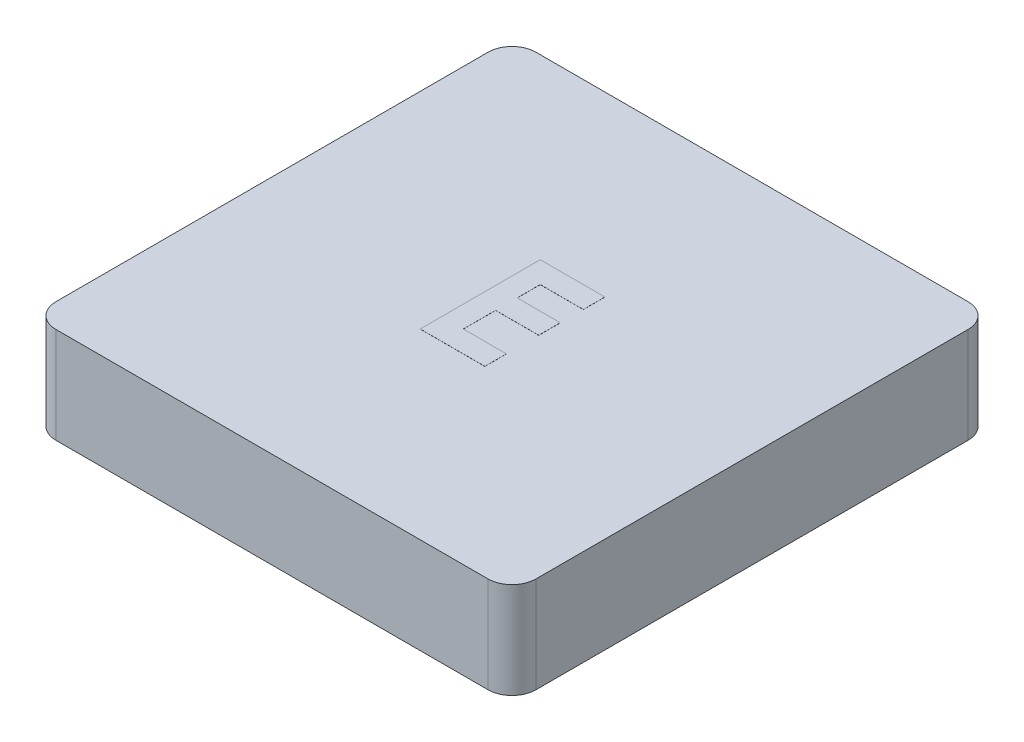
ISO-10303-21;
HEADER;
FILE_DESCRIPTION(('STEP AP214'),'2;1');
FILE_NAME('part.step','',(''),(''),'','','');
FILE_SCHEMA(('AUTOMOTIVE_DESIGN { 1 0 10303 214 1 1 1 1 }'));
ENDSEC;
DATA;
#1=APPLICATION_CONTEXT('core data for automotive mechanical design processes');
#2=APPLICATION_PROTOCOL_DEFINITION('international standard','automotive_design',2000,#1);
#3=PRODUCT_CONTEXT('',#1,'mechanical');
#4=PRODUCT('Part','Part','',(#3));
#5=PRODUCT_RELATED_PRODUCT_CATEGORY('part','',(#4));
#6=PRODUCT_DEFINITION_FORMATION('','',#4);
#7=PRODUCT_DEFINITION_CONTEXT('part definition',#1,'design');
#8=PRODUCT_DEFINITION('design','',#6,#7);
#9=PRODUCT_DEFINITION_SHAPE('','',#8);
#10=(LENGTH_UNIT() NAMED_UNIT(*) SI_UNIT(.MILLI.,.METRE.));
#11=(NAMED_UNIT(*) PLANE_ANGLE_UNIT() SI_UNIT($,.RADIAN.));
#12=(NAMED_UNIT(*) SI_UNIT($,.STERADIAN.) SOLID_ANGLE_UNIT());
#13=UNCERTAINTY_MEASURE_WITH_UNIT(LENGTH_MEASURE(1.E-05),#10,'distance_accuracy_value','');
#14=(GEOMETRIC_REPRESENTATION_CONTEXT(3) GLOBAL_UNCERTAINTY_ASSIGNED_CONTEXT((#13)) GLOBAL_UNIT_ASSIGNED_CONTEXT((#10,
#11,#12)) REPRESENTATION_CONTEXT('',''));
#15=CARTESIAN_POINT('',(0.,0.,0.));
#16=DIRECTION('',(0.,0.,1.));
#17=DIRECTION('',(1.,0.,0.));
#18=AXIS2_PLACEMENT_3D('',#15,#16,#17);
#19=CARTESIAN_POINT('',(0.,2.54,-12.7));
#20=DIRECTION('',(1.,0.,0.));
#21=DIRECTION('',(0.,0.,-1.));
#22=AXIS2_PLACEMENT_3D('',#19,#20,#21);
#23=PLANE('',#22);
#24=DIRECTION('',(0.,0.,1.));
#25=VECTOR('',#24,1.);
#26=CARTESIAN_POINT('',(0.,2.54,-12.7));
#27=LINE('',#26,#25);
#28=CARTESIAN_POINT('',(0.,2.54,-12.065));
#29=VERTEX_POINT('',#28);
#30=CARTESIAN_POINT('',(0.,2.54,-0.635));
#31=VERTEX_POINT('',#30);
#32=EDGE_CURVE('E336',#29,#31,#27,.T.);
#33=ORIENTED_EDGE('',*,*,#32,.F.);
#34=DIRECTION('',(0.,-1.,0.));
#35=VECTOR('',#34,1.);
#36=CARTESIAN_POINT('',(0.,2.54,-12.065));
#37=LINE('',#36,#35);
#38=CARTESIAN_POINT('',(0.,0.,-12.065));
#39=VERTEX_POINT('',#38);
#40=EDGE_CURVE('E361',#29,#39,#37,.T.);
#41=ORIENTED_EDGE('',*,*,#40,.T.);
#42=DIRECTION('',(0.,0.,1.));
#43=VECTOR('',#42,1.);
#44=CARTESIAN_POINT('',(0.,0.,-12.7));
#45=LINE('',#44,#43);
#46=CARTESIAN_POINT('',(0.,0.,-0.635));
#47=VERTEX_POINT('',#46);
#48=EDGE_CURVE('E316',#39,#47,#45,.T.);
#49=ORIENTED_EDGE('',*,*,#48,.T.);
#50=DIRECTION('',(0.,-1.,0.));
#51=VECTOR('',#50,1.);
#52=CARTESIAN_POINT('',(0.,2.54,-0.635));
#53=LINE('',#52,#51);
#54=EDGE_CURVE('E349',#47,#31,#53,.F.);
#55=ORIENTED_EDGE('',*,*,#54,.T.);
#56=EDGE_LOOP('',(#33,#41,#49,#55));
#57=FACE_BOUND('',#56,.T.);
#58=ADVANCED_FACE('F33',(#57),#23,.F.);
#59=CARTESIAN_POINT('',(0.,2.54,0.));
#60=DIRECTION('',(0.,0.,-1.));
#61=DIRECTION('',(-1.,0.,0.));
#62=AXIS2_PLACEMENT_3D('',#59,#60,#61);
#63=PLANE('',#62);
#64=DIRECTION('',(1.,0.,0.));
#65=VECTOR('',#64,1.);
#66=CARTESIAN_POINT('',(0.,0.,0.));
#67=LINE('',#66,#65);
#68=CARTESIAN_POINT('',(0.635,0.,0.));
#69=VERTEX_POINT('',#68);
#70=CARTESIAN_POINT('',(12.065,0.,0.));
#71=VERTEX_POINT('',#70);
#72=EDGE_CURVE('E352',#69,#71,#67,.T.);
#73=ORIENTED_EDGE('',*,*,#72,.T.);
#74=DIRECTION('',(0.,-1.,0.));
#75=VECTOR('',#74,1.);
#76=CARTESIAN_POINT('',(12.065,2.54,0.));
#77=LINE('',#76,#75);
#78=CARTESIAN_POINT('',(12.065,2.54,0.));
#79=VERTEX_POINT('',#78);
#80=EDGE_CURVE('E41',#71,#79,#77,.F.);
#81=ORIENTED_EDGE('',*,*,#80,.T.);
#82=DIRECTION('',(1.,0.,0.));
#83=VECTOR('',#82,1.);
#84=CARTESIAN_POINT('',(0.,2.54,0.));
#85=LINE('',#84,#83);
#86=CARTESIAN_POINT('',(0.635,2.54,0.));
#87=VERTEX_POINT('',#86);
#88=EDGE_CURVE('E339',#87,#79,#85,.T.);
#89=ORIENTED_EDGE('',*,*,#88,.F.);
#90=DIRECTION('',(0.,-1.,0.));
#91=VECTOR('',#90,1.);
#92=CARTESIAN_POINT('',(0.635,2.54,0.));
#93=LINE('',#92,#91);
#94=EDGE_CURVE('E390',#87,#69,#93,.T.);
#95=ORIENTED_EDGE('',*,*,#94,.T.);
#96=EDGE_LOOP('',(#73,#81,#89,#95));
#97=FACE_BOUND('',#96,.T.);
#98=ADVANCED_FACE('F395',(#97),#63,.F.);
#99=CARTESIAN_POINT('',(12.7,2.54,0.));
#100=DIRECTION('',(-1.,0.,0.));
#101=DIRECTION('',(0.,0.,1.));
#102=AXIS2_PLACEMENT_3D('',#99,#100,#101);
#103=PLANE('',#102);
#104=DIRECTION('',(0.,0.,-1.));
#105=VECTOR('',#104,1.);
#106=CARTESIAN_POINT('',(12.7,0.,0.));
#107=LINE('',#106,#105);
#108=CARTESIAN_POINT('',(12.7,0.,-0.635));
#109=VERTEX_POINT('',#108);
#110=CARTESIAN_POINT('',(12.7,0.,-12.065));
#111=VERTEX_POINT('',#110);
#112=EDGE_CURVE('E355',#109,#111,#107,.T.);
#113=ORIENTED_EDGE('',*,*,#112,.T.);
#114=DIRECTION('',(0.,-1.,0.));
#115=VECTOR('',#114,1.);
#116=CARTESIAN_POINT('',(12.7,2.54,-12.065));
#117=LINE('',#116,#115);
#118=CARTESIAN_POINT('',(12.7,2.54,-12.065));
#119=VERTEX_POINT('',#118);
#120=EDGE_CURVE('E388',#111,#119,#117,.F.);
#121=ORIENTED_EDGE('',*,*,#120,.T.);
#122=DIRECTION('',(0.,0.,-1.));
#123=VECTOR('',#122,1.);
#124=CARTESIAN_POINT('',(12.7,2.54,0.));
#125=LINE('',#124,#123);
#126=CARTESIAN_POINT('',(12.7,2.54,-0.635));
#127=VERTEX_POINT('',#126);
#128=EDGE_CURVE('E343',#127,#119,#125,.T.);
#129=ORIENTED_EDGE('',*,*,#128,.F.);
#130=DIRECTION('',(0.,-1.,0.));
#131=VECTOR('',#130,1.);
#132=CARTESIAN_POINT('',(12.7,2.54,-0.635));
#133=LINE('',#132,#131);
#134=EDGE_CURVE('E385',#127,#109,#133,.T.);
#135=ORIENTED_EDGE('',*,*,#134,.T.);
#136=EDGE_LOOP('',(#113,#121,#129,#135));
#137=FACE_BOUND('',#136,.T.);
#138=ADVANCED_FACE('F408',(#137),#103,.F.);
#139=CARTESIAN_POINT('',(12.7,2.54,-12.7));
#140=DIRECTION('',(0.,0.,1.));
#141=DIRECTION('',(1.,0.,0.));
#142=AXIS2_PLACEMENT_3D('',#139,#140,#141);
#143=PLANE('',#142);
#144=DIRECTION('',(-1.,0.,0.));
#145=VECTOR('',#144,1.);
#146=CARTESIAN_POINT('',(12.7,0.,-12.7));
#147=LINE('',#146,#145);
#148=CARTESIAN_POINT('',(12.065,0.,-12.7));
#149=VERTEX_POINT('',#148);
#150=CARTESIAN_POINT('',(0.634999999999995,0.,-12.7));
#151=VERTEX_POINT('',#150);
#152=EDGE_CURVE('E340',#149,#151,#147,.T.);
#153=ORIENTED_EDGE('',*,*,#152,.T.);
#154=DIRECTION('',(0.,-1.,0.));
#155=VECTOR('',#154,1.);
#156=CARTESIAN_POINT('',(0.634999999999995,2.54,-12.7));
#157=LINE('',#156,#155);
#158=CARTESIAN_POINT('',(0.634999999999995,2.54,-12.7));
#159=VERTEX_POINT('',#158);
#160=EDGE_CURVE('E375',#151,#159,#157,.F.);
#161=ORIENTED_EDGE('',*,*,#160,.T.);
#162=DIRECTION('',(-1.,0.,0.));
#163=VECTOR('',#162,1.);
#164=CARTESIAN_POINT('',(12.7,2.54,-12.7));
#165=LINE('',#164,#163);
#166=CARTESIAN_POINT('',(12.065,2.54,-12.7));
#167=VERTEX_POINT('',#166);
#168=EDGE_CURVE('E346',#167,#159,#165,.T.);
#169=ORIENTED_EDGE('',*,*,#168,.F.);
#170=DIRECTION('',(0.,-1.,0.));
#171=VECTOR('',#170,1.);
#172=CARTESIAN_POINT('',(12.065,2.54,-12.7));
#173=LINE('',#172,#171);
#174=EDGE_CURVE('E372',#167,#149,#173,.T.);
#175=ORIENTED_EDGE('',*,*,#174,.T.);
#176=EDGE_LOOP('',(#153,#161,#169,#175));
#177=FACE_BOUND('',#176,.T.);
#178=ADVANCED_FACE('F420',(#177),#143,.F.);
#179=CARTESIAN_POINT('',(0.,2.54,0.));
#180=DIRECTION('',(0.,1.,0.));
#181=DIRECTION('',(0.,0.,1.));
#182=AXIS2_PLACEMENT_3D('',#179,#180,#181);
#183=PLANE('',#182);
#184=DIRECTION('',(0.,0.,-1.));
#185=VECTOR('',#184,1.);
#186=CARTESIAN_POINT('',(5.44634615384615,2.54,-4.826));
#187=LINE('',#186,#185);
#188=CARTESIAN_POINT('',(5.44634615384615,2.54,-4.826));
#189=VERTEX_POINT('',#188);
#190=CARTESIAN_POINT('',(5.44634615384615,2.54,-8.001));
#191=VERTEX_POINT('',#190);
#192=EDGE_CURVE('E248',#189,#191,#187,.T.);
#193=ORIENTED_EDGE('',*,*,#192,.T.);
#194=DIRECTION('',(1.,0.,0.));
#195=VECTOR('',#194,1.);
#196=CARTESIAN_POINT('',(5.44634615384615,2.54,-8.001));
#197=LINE('',#196,#195);
#198=CARTESIAN_POINT('',(7.15596153846153,2.54,-8.001));
#199=VERTEX_POINT('',#198);
#200=EDGE_CURVE('E199',#191,#199,#197,.T.);
#201=ORIENTED_EDGE('',*,*,#200,.T.);
#202=DIRECTION('',(0.,0.,1.));
#203=VECTOR('',#202,1.);
#204=CARTESIAN_POINT('',(7.15596153846153,2.54,-8.001));
#205=LINE('',#204,#203);
#206=CARTESIAN_POINT('',(7.15596153846153,2.54,-7.4311282051282));
#207=VERTEX_POINT('',#206);
#208=EDGE_CURVE('E251',#199,#207,#205,.T.);
#209=ORIENTED_EDGE('',*,*,#208,.T.);
#210=DIRECTION('',(-1.,0.,0.));
#211=VECTOR('',#210,1.);
#212=CARTESIAN_POINT('',(7.15596153846153,2.54,-7.4311282051282));
#213=LINE('',#212,#211);
#214=CARTESIAN_POINT('',(6.01621794871794,2.54,-7.4311282051282));
#215=VERTEX_POINT('',#214);
#216=EDGE_CURVE('E253',#207,#215,#213,.T.);
#217=ORIENTED_EDGE('',*,*,#216,.T.);
#218=DIRECTION('',(0.,0.,1.));
#219=VECTOR('',#218,1.);
#220=CARTESIAN_POINT('',(6.01621794871794,2.54,-7.4311282051282));
#221=LINE('',#220,#219);
#222=CARTESIAN_POINT('',(6.01621794871794,2.54,-6.82055128205128));
#223=VERTEX_POINT('',#222);
#224=EDGE_CURVE('E255',#215,#223,#221,.T.);
#225=ORIENTED_EDGE('',*,*,#224,.T.);
#226=DIRECTION('',(1.,0.,0.));
#227=VECTOR('',#226,1.);
#228=CARTESIAN_POINT('',(6.01621794871794,2.54,-6.82055128205128));
#229=LINE('',#228,#227);
#230=CARTESIAN_POINT('',(7.15596153846153,2.54,-6.82055128205128));
#231=VERTEX_POINT('',#230);
#232=EDGE_CURVE('E257',#223,#231,#229,.T.);
#233=ORIENTED_EDGE('',*,*,#232,.T.);
#234=DIRECTION('',(0.,0.,1.));
#235=VECTOR('',#234,1.);
#236=CARTESIAN_POINT('',(7.15596153846153,2.54,-6.82055128205128));
#237=LINE('',#236,#235);
#238=CARTESIAN_POINT('',(7.15596153846153,2.54,-6.25067948717949));
#239=VERTEX_POINT('',#238);
#240=EDGE_CURVE('E259',#231,#239,#237,.T.);
#241=ORIENTED_EDGE('',*,*,#240,.T.);
#242=DIRECTION('',(-1.,0.,0.));
#243=VECTOR('',#242,1.);
#244=CARTESIAN_POINT('',(7.15596153846153,2.54,-6.25067948717949));
#245=LINE('',#244,#243);
#246=CARTESIAN_POINT('',(6.01621794871794,2.54,-6.25067948717949));
#247=VERTEX_POINT('',#246);
#248=EDGE_CURVE('E261',#239,#247,#245,.T.);
#249=ORIENTED_EDGE('',*,*,#248,.T.);
#250=DIRECTION('',(0.,0.,1.));
#251=VECTOR('',#250,1.);
#252=CARTESIAN_POINT('',(6.01621794871794,2.54,-6.25067948717949));
#253=LINE('',#252,#251);
#254=CARTESIAN_POINT('',(6.01621794871794,2.54,-5.39587179487179));
#255=VERTEX_POINT('',#254);
#256=EDGE_CURVE('E263',#247,#255,#253,.T.);
#257=ORIENTED_EDGE('',*,*,#256,.T.);
#258=DIRECTION('',(1.,0.,0.));
#259=VECTOR('',#258,1.);
#260=CARTESIAN_POINT('',(6.01621794871794,2.54,-5.39587179487179));
#261=LINE('',#260,#259);
#262=CARTESIAN_POINT('',(7.15596153846153,2.54,-5.39587179487179));
#263=VERTEX_POINT('',#262);
#264=EDGE_CURVE('E265',#255,#263,#261,.T.);
#265=ORIENTED_EDGE('',*,*,#264,.T.);
#266=DIRECTION('',(0.,0.,1.));
#267=VECTOR('',#266,1.);
#268=CARTESIAN_POINT('',(7.15596153846153,2.54,-5.39587179487179));
#269=LINE('',#268,#267);
#270=CARTESIAN_POINT('',(7.15596153846153,2.54,-4.826));
#271=VERTEX_POINT('',#270);
#272=EDGE_CURVE('E53',#263,#271,#269,.T.);
#273=ORIENTED_EDGE('',*,*,#272,.T.);
#274=DIRECTION('',(-1.,0.,0.));
#275=VECTOR('',#274,1.);
#276=CARTESIAN_POINT('',(7.15596153846153,2.54,-4.826));
#277=LINE('',#276,#275);
#278=EDGE_CURVE('E48',#271,#189,#277,.T.);
#279=ORIENTED_EDGE('',*,*,#278,.T.);
#280=EDGE_LOOP('',(#193,#201,#209,#217,#225,#233,#241,#249,#257,#265,#273,#279));
#281=FACE_BOUND('',#280,.T.);
#282=ORIENTED_EDGE('',*,*,#168,.T.);
#283=CARTESIAN_POINT('',(0.634999999999995,2.54,-12.065));
#284=DIRECTION('',(0.,1.,0.));
#285=DIRECTION('',(0.,0.,1.));
#286=AXIS2_PLACEMENT_3D('',#283,#284,#285);
#287=CIRCLE('',#286,0.635);
#288=EDGE_CURVE('E383',#159,#29,#287,.T.);
#289=ORIENTED_EDGE('',*,*,#288,.T.);
#290=ORIENTED_EDGE('',*,*,#32,.T.);
#291=CARTESIAN_POINT('',(0.635,2.54,-0.635));
#292=DIRECTION('',(0.,1.,0.));
#293=DIRECTION('',(0.,0.,1.));
#294=AXIS2_PLACEMENT_3D('',#291,#292,#293);
#295=CIRCLE('',#294,0.635);
#296=EDGE_CURVE('E377',#31,#87,#295,.T.);
#297=ORIENTED_EDGE('',*,*,#296,.T.);
#298=ORIENTED_EDGE('',*,*,#88,.T.);
#299=CARTESIAN_POINT('',(12.065,2.54,-0.635));
#300=DIRECTION('',(0.,1.,0.));
#301=DIRECTION('',(0.,0.,1.));
#302=AXIS2_PLACEMENT_3D('',#299,#300,#301);
#303=CIRCLE('',#302,0.635);
#304=EDGE_CURVE('E379',#79,#127,#303,.T.);
#305=ORIENTED_EDGE('',*,*,#304,.T.);
#306=ORIENTED_EDGE('',*,*,#128,.T.);
#307=CARTESIAN_POINT('',(12.065,2.54,-12.065));
#308=DIRECTION('',(0.,1.,0.));
#309=DIRECTION('',(0.,0.,1.));
#310=AXIS2_PLACEMENT_3D('',#307,#308,#309);
#311=CIRCLE('',#310,0.635);
#312=EDGE_CURVE('E381',#119,#167,#311,.T.);
#313=ORIENTED_EDGE('',*,*,#312,.T.);
#314=EDGE_LOOP('',(#282,#289,#290,#297,#298,#305,#306,#313));
#315=FACE_BOUND('',#314,.T.);
#316=ADVANCED_FACE('F401',(#281,#315),#183,.T.);
#317=CARTESIAN_POINT('',(0.,0.,0.));
#318=DIRECTION('',(0.,1.,0.));
#319=DIRECTION('',(0.,0.,1.));
#320=AXIS2_PLACEMENT_3D('',#317,#318,#319);
#321=PLANE('',#320);
#322=DIRECTION('',(-1.,0.,0.));
#323=VECTOR('',#322,1.);
#324=CARTESIAN_POINT('',(12.7,0.,-12.065));
#325=LINE('',#324,#323);
#326=CARTESIAN_POINT('',(12.065,0.,-12.065));
#327=VERTEX_POINT('',#326);
#328=CARTESIAN_POINT('',(0.634999999999995,0.,-12.065));
#329=VERTEX_POINT('',#328);
#330=EDGE_CURVE('E304',#327,#329,#325,.T.);
#331=ORIENTED_EDGE('',*,*,#330,.T.);
#332=DIRECTION('',(0.,0.,1.));
#333=VECTOR('',#332,1.);
#334=CARTESIAN_POINT('',(0.634999999999995,0.,-12.7));
#335=LINE('',#334,#333);
#336=CARTESIAN_POINT('',(0.635,0.,-0.635));
#337=VERTEX_POINT('',#336);
#338=EDGE_CURVE('E299',#329,#337,#335,.T.);
#339=ORIENTED_EDGE('',*,*,#338,.T.);
#340=DIRECTION('',(1.,0.,0.));
#341=VECTOR('',#340,1.);
#342=CARTESIAN_POINT('',(0.,0.,-0.635));
#343=LINE('',#342,#341);
#344=CARTESIAN_POINT('',(12.065,0.,-0.635));
#345=VERTEX_POINT('',#344);
#346=EDGE_CURVE('E328',#337,#345,#343,.T.);
#347=ORIENTED_EDGE('',*,*,#346,.T.);
#348=DIRECTION('',(0.,0.,-1.));
#349=VECTOR('',#348,1.);
#350=CARTESIAN_POINT('',(12.065,0.,0.));
#351=LINE('',#350,#349);
#352=EDGE_CURVE('E331',#345,#327,#351,.T.);
#353=ORIENTED_EDGE('',*,*,#352,.T.);
#354=EDGE_LOOP('',(#331,#339,#347,#353));
#355=FACE_BOUND('',#354,.T.);
#356=ORIENTED_EDGE('',*,*,#48,.F.);
#357=CARTESIAN_POINT('',(0.634999999999995,0.,-12.065));
#358=DIRECTION('',(0.,1.,0.));
#359=DIRECTION('',(0.,0.,1.));
#360=AXIS2_PLACEMENT_3D('',#357,#358,#359);
#361=CIRCLE('',#360,0.635);
#362=EDGE_CURVE('E370',#39,#151,#361,.F.);
#363=ORIENTED_EDGE('',*,*,#362,.T.);
#364=ORIENTED_EDGE('',*,*,#152,.F.);
#365=CARTESIAN_POINT('',(12.065,0.,-12.065));
#366=DIRECTION('',(0.,1.,0.));
#367=DIRECTION('',(0.,0.,1.));
#368=AXIS2_PLACEMENT_3D('',#365,#366,#367);
#369=CIRCLE('',#368,0.635);
#370=EDGE_CURVE('E368',#149,#111,#369,.F.);
#371=ORIENTED_EDGE('',*,*,#370,.T.);
#372=ORIENTED_EDGE('',*,*,#112,.F.);
#373=CARTESIAN_POINT('',(12.065,0.,-0.635));
#374=DIRECTION('',(0.,1.,0.));
#375=DIRECTION('',(0.,0.,1.));
#376=AXIS2_PLACEMENT_3D('',#373,#374,#375);
#377=CIRCLE('',#376,0.635);
#378=EDGE_CURVE('E366',#109,#71,#377,.F.);
#379=ORIENTED_EDGE('',*,*,#378,.T.);
#380=ORIENTED_EDGE('',*,*,#72,.F.);
#381=CARTESIAN_POINT('',(0.635,0.,-0.635));
#382=DIRECTION('',(0.,1.,0.));
#383=DIRECTION('',(0.,0.,1.));
#384=AXIS2_PLACEMENT_3D('',#381,#382,#383);
#385=CIRCLE('',#384,0.635);
#386=EDGE_CURVE('E364',#69,#47,#385,.F.);
#387=ORIENTED_EDGE('',*,*,#386,.T.);
#388=EDGE_LOOP('',(#356,#363,#364,#371,#372,#379,#380,#387));
#389=FACE_BOUND('',#388,.T.);
#390=ADVANCED_FACE('F412',(#355,#389),#321,.F.);
#391=CARTESIAN_POINT('',(0.634999999999995,2.54,-12.065));
#392=DIRECTION('',(0.,-1.,0.));
#393=DIRECTION('',(0.,0.,-1.));
#394=AXIS2_PLACEMENT_3D('',#391,#392,#393);
#395=CYLINDRICAL_SURFACE('',#394,0.635);
#396=ORIENTED_EDGE('',*,*,#288,.F.);
#397=ORIENTED_EDGE('',*,*,#160,.F.);
#398=ORIENTED_EDGE('',*,*,#362,.F.);
#399=ORIENTED_EDGE('',*,*,#40,.F.);
#400=EDGE_LOOP('',(#396,#397,#398,#399));
#401=FACE_BOUND('',#400,.T.);
#402=ADVANCED_FACE('F426',(#401),#395,.T.);
#403=CARTESIAN_POINT('',(12.065,2.54,-12.065));
#404=DIRECTION('',(0.,-1.,0.));
#405=DIRECTION('',(0.,0.,-1.));
#406=AXIS2_PLACEMENT_3D('',#403,#404,#405);
#407=CYLINDRICAL_SURFACE('',#406,0.635);
#408=ORIENTED_EDGE('',*,*,#312,.F.);
#409=ORIENTED_EDGE('',*,*,#120,.F.);
#410=ORIENTED_EDGE('',*,*,#370,.F.);
#411=ORIENTED_EDGE('',*,*,#174,.F.);
#412=EDGE_LOOP('',(#408,#409,#410,#411));
#413=FACE_BOUND('',#412,.T.);
#414=ADVANCED_FACE('F417',(#413),#407,.T.);
#415=CARTESIAN_POINT('',(12.065,2.54,-0.635));
#416=DIRECTION('',(0.,-1.,0.));
#417=DIRECTION('',(0.,0.,-1.));
#418=AXIS2_PLACEMENT_3D('',#415,#416,#417);
#419=CYLINDRICAL_SURFACE('',#418,0.635);
#420=ORIENTED_EDGE('',*,*,#304,.F.);
#421=ORIENTED_EDGE('',*,*,#80,.F.);
#422=ORIENTED_EDGE('',*,*,#378,.F.);
#423=ORIENTED_EDGE('',*,*,#134,.F.);
#424=EDGE_LOOP('',(#420,#421,#422,#423));
#425=FACE_BOUND('',#424,.T.);
#426=ADVANCED_FACE('F405',(#425),#419,.T.);
#427=CARTESIAN_POINT('',(0.635,2.54,-0.635));
#428=DIRECTION('',(0.,-1.,0.));
#429=DIRECTION('',(0.,0.,-1.));
#430=AXIS2_PLACEMENT_3D('',#427,#428,#429);
#431=CYLINDRICAL_SURFACE('',#430,0.635);
#432=ORIENTED_EDGE('',*,*,#296,.F.);
#433=ORIENTED_EDGE('',*,*,#54,.F.);
#434=ORIENTED_EDGE('',*,*,#386,.F.);
#435=ORIENTED_EDGE('',*,*,#94,.F.);
#436=EDGE_LOOP('',(#432,#433,#434,#435));
#437=FACE_BOUND('',#436,.T.);
#438=ADVANCED_FACE('F35',(#437),#431,.T.);
#439=CARTESIAN_POINT('',(0.634999999999995,2.54,-12.7));
#440=DIRECTION('',(1.,0.,0.));
#441=DIRECTION('',(0.,0.,-1.));
#442=AXIS2_PLACEMENT_3D('',#439,#440,#441);
#443=PLANE('',#442);
#444=DIRECTION('',(0.,0.,1.));
#445=VECTOR('',#444,1.);
#446=CARTESIAN_POINT('',(0.634999999999995,1.905,-12.7));
#447=LINE('',#446,#445);
#448=CARTESIAN_POINT('',(0.634999999999995,1.905,-12.065));
#449=VERTEX_POINT('',#448);
#450=CARTESIAN_POINT('',(0.635,1.905,-0.635));
#451=VERTEX_POINT('',#450);
#452=EDGE_CURVE('E300',#449,#451,#447,.T.);
#453=ORIENTED_EDGE('',*,*,#452,.T.);
#454=DIRECTION('',(0.,1.,0.));
#455=VECTOR('',#454,1.);
#456=CARTESIAN_POINT('',(0.635,2.54,-0.635));
#457=LINE('',#456,#455);
#458=EDGE_CURVE('E309',#337,#451,#457,.T.);
#459=ORIENTED_EDGE('',*,*,#458,.F.);
#460=ORIENTED_EDGE('',*,*,#338,.F.);
#461=DIRECTION('',(0.,1.,0.));
#462=VECTOR('',#461,1.);
#463=CARTESIAN_POINT('',(0.634999999999995,2.54,-12.065));
#464=LINE('',#463,#462);
#465=EDGE_CURVE('E305',#329,#449,#464,.T.);
#466=ORIENTED_EDGE('',*,*,#465,.T.);
#467=EDGE_LOOP('',(#453,#459,#460,#466));
#468=FACE_BOUND('',#467,.T.);
#469=ADVANCED_FACE('F431',(#468),#443,.T.);
#470=CARTESIAN_POINT('',(0.,2.54,-0.635));
#471=DIRECTION('',(0.,0.,-1.));
#472=DIRECTION('',(-1.,0.,0.));
#473=AXIS2_PLACEMENT_3D('',#470,#471,#472);
#474=PLANE('',#473);
#475=ORIENTED_EDGE('',*,*,#346,.F.);
#476=ORIENTED_EDGE('',*,*,#458,.T.);
#477=DIRECTION('',(1.,0.,0.));
#478=VECTOR('',#477,1.);
#479=CARTESIAN_POINT('',(0.,1.905,-0.635));
#480=LINE('',#479,#478);
#481=CARTESIAN_POINT('',(12.065,1.905,-0.635));
#482=VERTEX_POINT('',#481);
#483=EDGE_CURVE('E303',#451,#482,#480,.T.);
#484=ORIENTED_EDGE('',*,*,#483,.T.);
#485=DIRECTION('',(0.,1.,0.));
#486=VECTOR('',#485,1.);
#487=CARTESIAN_POINT('',(12.065,2.54,-0.635));
#488=LINE('',#487,#486);
#489=EDGE_CURVE('E313',#345,#482,#488,.T.);
#490=ORIENTED_EDGE('',*,*,#489,.F.);
#491=EDGE_LOOP('',(#475,#476,#484,#490));
#492=FACE_BOUND('',#491,.T.);
#493=ADVANCED_FACE('F436',(#492),#474,.T.);
#494=CARTESIAN_POINT('',(12.065,2.54,0.));
#495=DIRECTION('',(-1.,0.,0.));
#496=DIRECTION('',(0.,0.,1.));
#497=AXIS2_PLACEMENT_3D('',#494,#495,#496);
#498=PLANE('',#497);
#499=ORIENTED_EDGE('',*,*,#352,.F.);
#500=ORIENTED_EDGE('',*,*,#489,.T.);
#501=DIRECTION('',(0.,0.,-1.));
#502=VECTOR('',#501,1.);
#503=CARTESIAN_POINT('',(12.065,1.905,0.));
#504=LINE('',#503,#502);
#505=CARTESIAN_POINT('',(12.065,1.905,-12.065));
#506=VERTEX_POINT('',#505);
#507=EDGE_CURVE('E319',#482,#506,#504,.T.);
#508=ORIENTED_EDGE('',*,*,#507,.T.);
#509=DIRECTION('',(0.,1.,0.));
#510=VECTOR('',#509,1.);
#511=CARTESIAN_POINT('',(12.065,2.54,-12.065));
#512=LINE('',#511,#510);
#513=EDGE_CURVE('E308',#327,#506,#512,.T.);
#514=ORIENTED_EDGE('',*,*,#513,.F.);
#515=EDGE_LOOP('',(#499,#500,#508,#514));
#516=FACE_BOUND('',#515,.T.);
#517=ADVANCED_FACE('F489',(#516),#498,.T.);
#518=CARTESIAN_POINT('',(12.7,2.54,-12.065));
#519=DIRECTION('',(0.,0.,1.));
#520=DIRECTION('',(1.,0.,0.));
#521=AXIS2_PLACEMENT_3D('',#518,#519,#520);
#522=PLANE('',#521);
#523=ORIENTED_EDGE('',*,*,#330,.F.);
#524=ORIENTED_EDGE('',*,*,#513,.T.);
#525=DIRECTION('',(-1.,0.,0.));
#526=VECTOR('',#525,1.);
#527=CARTESIAN_POINT('',(12.7,1.905,-12.065));
#528=LINE('',#527,#526);
#529=EDGE_CURVE('E312',#506,#449,#528,.T.);
#530=ORIENTED_EDGE('',*,*,#529,.T.);
#531=ORIENTED_EDGE('',*,*,#465,.F.);
#532=EDGE_LOOP('',(#523,#524,#530,#531));
#533=FACE_BOUND('',#532,.T.);
#534=ADVANCED_FACE('F499',(#533),#522,.T.);
#535=CARTESIAN_POINT('',(0.,1.905,0.));
#536=DIRECTION('',(0.,1.,0.));
#537=DIRECTION('',(0.,0.,1.));
#538=AXIS2_PLACEMENT_3D('',#535,#536,#537);
#539=PLANE('',#538);
#540=CARTESIAN_POINT('',(6.34999999999999,1.905,-6.35));
#541=DIRECTION('',(0.,1.,0.));
#542=DIRECTION('',(0.,0.,1.));
#543=AXIS2_PLACEMENT_3D('',#540,#541,#542);
#544=CIRCLE('',#543,2.54);
#545=CARTESIAN_POINT('',(6.34999999999999,1.905,-3.81));
#546=VERTEX_POINT('',#545);
#547=EDGE_CURVE('E11',#546,#546,#544,.F.);
#548=ORIENTED_EDGE('',*,*,#547,.F.);
#549=EDGE_LOOP('',(#548));
#550=FACE_BOUND('',#549,.T.);
#551=ORIENTED_EDGE('',*,*,#529,.F.);
#552=ORIENTED_EDGE('',*,*,#507,.F.);
#553=ORIENTED_EDGE('',*,*,#483,.F.);
#554=ORIENTED_EDGE('',*,*,#452,.F.);
#555=EDGE_LOOP('',(#551,#552,#553,#554));
#556=FACE_BOUND('',#555,.T.);
#557=ADVANCED_FACE('F509',(#550,#556),#539,.F.);
#558=CARTESIAN_POINT('',(6.34999999999999,-7.18420489685532,-6.35));
#559=DIRECTION('',(0.,1.,0.));
#560=DIRECTION('',(0.,0.,1.));
#561=AXIS2_PLACEMENT_3D('',#558,#559,#560);
#562=CYLINDRICAL_SURFACE('',#561,2.54);
#563=CARTESIAN_POINT('',(6.34999999999999,0.,-6.35));
#564=DIRECTION('',(0.,1.,0.));
#565=DIRECTION('',(0.,0.,1.));
#566=AXIS2_PLACEMENT_3D('',#563,#564,#565);
#567=CIRCLE('',#566,2.54);
#568=CARTESIAN_POINT('',(6.34999999999999,0.,-3.81));
#569=VERTEX_POINT('',#568);
#570=EDGE_CURVE('E269',#569,#569,#567,.T.);
#571=CARTESIAN_POINT('',(6.34999999999999,0.,-3.81));
#572=CARTESIAN_POINT('',(6.34999999999999,0.0198437499999991,-3.81));
#573=CARTESIAN_POINT('',(6.34999999999999,0.0396874999999989,-3.81));
#574=CARTESIAN_POINT('',(6.34999999999999,0.079374999999999,-3.81));
#575=CARTESIAN_POINT('',(6.34999999999999,0.0992187499999992,-3.81));
#576=CARTESIAN_POINT('',(6.34999999999999,0.138906249999999,-3.81));
#577=CARTESIAN_POINT('',(6.34999999999999,0.158749999999999,-3.81));
#578=CARTESIAN_POINT('',(6.34999999999999,0.198437499999999,-3.81));
#579=CARTESIAN_POINT('',(6.34999999999999,0.218281249999999,-3.81));
#580=CARTESIAN_POINT('',(6.34999999999999,0.25796875,-3.81));
#581=CARTESIAN_POINT('',(6.34999999999999,0.277812499999999,-3.81));
#582=CARTESIAN_POINT('',(6.34999999999999,0.317499999999999,-3.81));
#583=CARTESIAN_POINT('',(6.34999999999999,0.337343749999999,-3.81));
#584=CARTESIAN_POINT('',(6.34999999999999,0.377031249999999,-3.81));
#585=CARTESIAN_POINT('',(6.34999999999999,0.396874999999999,-3.81));
#586=CARTESIAN_POINT('',(6.34999999999999,0.436562499999999,-3.81));
#587=CARTESIAN_POINT('',(6.34999999999999,0.456406249999999,-3.81));
#588=CARTESIAN_POINT('',(6.34999999999999,0.496093749999999,-3.81));
#589=CARTESIAN_POINT('',(6.34999999999999,0.515937499999999,-3.81));
#590=CARTESIAN_POINT('',(6.34999999999999,0.555624999999999,-3.81));
#591=CARTESIAN_POINT('',(6.34999999999999,0.575468749999999,-3.81));
#592=CARTESIAN_POINT('',(6.34999999999999,0.615156249999999,-3.81));
#593=CARTESIAN_POINT('',(6.34999999999999,0.634999999999999,-3.81));
#594=CARTESIAN_POINT('',(6.34999999999999,0.674687499999998,-3.81));
#595=CARTESIAN_POINT('',(6.34999999999999,0.694531249999998,-3.81));
#596=CARTESIAN_POINT('',(6.34999999999999,0.734218749999998,-3.81));
#597=CARTESIAN_POINT('',(6.34999999999999,0.754062499999998,-3.81));
#598=CARTESIAN_POINT('',(6.34999999999999,0.793749999999998,-3.81));
#599=CARTESIAN_POINT('',(6.34999999999999,0.813593749999999,-3.81));
#600=CARTESIAN_POINT('',(6.34999999999999,0.853281249999999,-3.81));
#601=CARTESIAN_POINT('',(6.34999999999999,0.873124999999999,-3.81));
#602=CARTESIAN_POINT('',(6.34999999999999,0.912812499999999,-3.81));
#603=CARTESIAN_POINT('',(6.34999999999999,0.932656249999999,-3.81));
#604=CARTESIAN_POINT('',(6.34999999999999,0.972343749999998,-3.81));
#605=CARTESIAN_POINT('',(6.34999999999999,0.992187499999998,-3.81));
#606=CARTESIAN_POINT('',(6.34999999999999,1.031875,-3.81));
#607=CARTESIAN_POINT('',(6.34999999999999,1.05171875,-3.81));
#608=CARTESIAN_POINT('',(6.34999999999999,1.09140625,-3.81));
#609=CARTESIAN_POINT('',(6.34999999999999,1.11125,-3.81));
#610=CARTESIAN_POINT('',(6.34999999999999,1.1509375,-3.81));
#611=CARTESIAN_POINT('',(6.34999999999999,1.17078125,-3.81));
#612=CARTESIAN_POINT('',(6.34999999999999,1.21046875,-3.81));
#613=CARTESIAN_POINT('',(6.34999999999999,1.2303125,-3.81));
#614=CARTESIAN_POINT('',(6.34999999999999,1.27,-3.81));
#615=CARTESIAN_POINT('',(6.34999999999999,1.28984375,-3.81));
#616=CARTESIAN_POINT('',(6.34999999999999,1.32953125,-3.81));
#617=CARTESIAN_POINT('',(6.34999999999999,1.349375,-3.81));
#618=CARTESIAN_POINT('',(6.34999999999999,1.3890625,-3.81));
#619=CARTESIAN_POINT('',(6.34999999999999,1.40890625,-3.81));
#620=CARTESIAN_POINT('',(6.34999999999999,1.44859375,-3.81));
#621=CARTESIAN_POINT('',(6.34999999999999,1.4684375,-3.81));
#622=CARTESIAN_POINT('',(6.34999999999999,1.508125,-3.81));
#623=CARTESIAN_POINT('',(6.34999999999999,1.52796875,-3.81));
#624=CARTESIAN_POINT('',(6.34999999999999,1.56765625,-3.81));
#625=CARTESIAN_POINT('',(6.34999999999999,1.5875,-3.81));
#626=CARTESIAN_POINT('',(6.34999999999999,1.6271875,-3.81));
#627=CARTESIAN_POINT('',(6.34999999999999,1.64703125,-3.81));
#628=CARTESIAN_POINT('',(6.34999999999999,1.68671875,-3.81));
#629=CARTESIAN_POINT('',(6.34999999999999,1.7065625,-3.81));
#630=CARTESIAN_POINT('',(6.34999999999999,1.74625,-3.81));
#631=CARTESIAN_POINT('',(6.34999999999999,1.76609375,-3.81));
#632=CARTESIAN_POINT('',(6.34999999999999,1.80578125,-3.81));
#633=CARTESIAN_POINT('',(6.34999999999999,1.825625,-3.81));
#634=CARTESIAN_POINT('',(6.34999999999999,1.8653125,-3.81));
#635=CARTESIAN_POINT('',(6.34999999999999,1.88515625,-3.81));
#636=CARTESIAN_POINT('',(6.34999999999999,1.905,-3.81));
#637=B_SPLINE_CURVE_WITH_KNOTS('',3,(#571,#572,#573,#574,#575,#576,#577,#578,#579,#580,#581,
#582,#583,#584,#585,#586,#587,#588,#589,#590,#591,#592,#593,#594,#595,#596,#597,#598,#599,#600,
#601,#602,#603,#604,#605,#606,#607,#608,#609,#610,#611,#612,#613,#614,#615,#616,#617,#618,#619,
#620,#621,#622,#623,#624,#625,#626,#627,#628,#629,#630,#631,#632,#633,#634,#635,#636),
.UNSPECIFIED.,.F.,.F.,(4,2,2,2,2,2,2,2,2,2,2,2,2,2,2,2,2,2,2,2,2,2,2,2,2,2,2,2,2,2,2,2,4),(0.,
0.0595312499999997,0.1190625,0.17859375,0.238125,0.29765625,0.3571875,0.41671875,0.47625,
0.53578125,0.5953125,0.654843749999999,0.714374999999999,0.773906249999999,0.8334375,0.89296875,
0.952499999999999,1.01203125,1.0715625,1.13109375,1.190625,1.25015625,1.3096875,1.36921875,
1.42875,1.48828125,1.5478125,1.60734375,1.666875,1.72640625,1.7859375,1.84546875,1.905),.UNSPECIFIED.);
#638=EDGE_CURVE('BSEAM519',#569,#546,#637,.T.);
#639=ORIENTED_EDGE('',*,*,#570,.T.);
#640=ORIENTED_EDGE('',*,*,#547,.T.);
#641=ORIENTED_EDGE('',*,*,#638,.T.);
#642=ORIENTED_EDGE('',*,*,#638,.F.);
#643=EDGE_LOOP('',(#639,#641,#640,#642));
#644=FACE_BOUND('',#643,.T.);
#645=ADVANCED_FACE('F519',(#644),#562,.T.);
#646=CARTESIAN_POINT('',(0.,0.,0.));
#647=DIRECTION('',(0.,1.,0.));
#648=DIRECTION('',(0.,0.,1.));
#649=AXIS2_PLACEMENT_3D('',#646,#647,#648);
#650=PLANE('',#649);
#651=ORIENTED_EDGE('',*,*,#570,.F.);
#652=EDGE_LOOP('',(#651));
#653=FACE_BOUND('',#652,.T.);
#654=ADVANCED_FACE('F529',(#653),#650,.F.);
#655=CARTESIAN_POINT('',(5.44634615384615,2.54254,-4.826));
#656=DIRECTION('',(-1.,0.,0.));
#657=DIRECTION('',(0.,0.,1.));
#658=AXIS2_PLACEMENT_3D('',#655,#656,#657);
#659=PLANE('',#658);
#660=ORIENTED_EDGE('',*,*,#192,.F.);
#661=DIRECTION('',(0.,-1.,0.));
#662=VECTOR('',#661,1.);
#663=CARTESIAN_POINT('',(5.44634615384615,2.54254,-4.826));
#664=LINE('',#663,#662);
#665=CARTESIAN_POINT('',(5.44634615384615,2.54254,-4.826));
#666=VERTEX_POINT('',#665);
#667=EDGE_CURVE('E218',#666,#189,#664,.T.);
#668=ORIENTED_EDGE('',*,*,#667,.F.);
#669=DIRECTION('',(0.,0.,-1.));
#670=VECTOR('',#669,1.);
#671=CARTESIAN_POINT('',(5.44634615384615,2.54254,-4.826));
#672=LINE('',#671,#670);
#673=CARTESIAN_POINT('',(5.44634615384615,2.54254,-8.001));
#674=VERTEX_POINT('',#673);
#675=EDGE_CURVE('E211',#666,#674,#672,.T.);
#676=ORIENTED_EDGE('',*,*,#675,.T.);
#677=DIRECTION('',(0.,-1.,0.));
#678=VECTOR('',#677,1.);
#679=CARTESIAN_POINT('',(5.44634615384615,2.54254,-8.001));
#680=LINE('',#679,#678);
#681=EDGE_CURVE('E194',#674,#191,#680,.T.);
#682=ORIENTED_EDGE('',*,*,#681,.T.);
#683=EDGE_LOOP('',(#660,#668,#676,#682));
#684=FACE_BOUND('',#683,.T.);
#685=ADVANCED_FACE('F217',(#684),#659,.T.);
#686=CARTESIAN_POINT('',(7.15596153846153,2.54254,-4.826));
#687=DIRECTION('',(0.,0.,1.));
#688=DIRECTION('',(1.,0.,0.));
#689=AXIS2_PLACEMENT_3D('',#686,#687,#688);
#690=PLANE('',#689);
#691=ORIENTED_EDGE('',*,*,#278,.F.);
#692=DIRECTION('',(0.,-1.,0.));
#693=VECTOR('',#692,1.);
#694=CARTESIAN_POINT('',(7.15596153846153,2.54254,-4.826));
#695=LINE('',#694,#693);
#696=CARTESIAN_POINT('',(7.15596153846153,2.54254,-4.826));
#697=VERTEX_POINT('',#696);
#698=EDGE_CURVE('E270',#697,#271,#695,.T.);
#699=ORIENTED_EDGE('',*,*,#698,.F.);
#700=DIRECTION('',(-1.,0.,0.));
#701=VECTOR('',#700,1.);
#702=CARTESIAN_POINT('',(7.15596153846153,2.54254,-4.826));
#703=LINE('',#702,#701);
#704=EDGE_CURVE('E204',#697,#666,#703,.T.);
#705=ORIENTED_EDGE('',*,*,#704,.T.);
#706=ORIENTED_EDGE('',*,*,#667,.T.);
#707=EDGE_LOOP('',(#691,#699,#705,#706));
#708=FACE_BOUND('',#707,.T.);
#709=ADVANCED_FACE('F556',(#708),#690,.T.);
#710=CARTESIAN_POINT('',(7.15596153846153,2.54254,-5.39587179487179));
#711=DIRECTION('',(1.,0.,0.));
#712=DIRECTION('',(0.,0.,-1.));
#713=AXIS2_PLACEMENT_3D('',#710,#711,#712);
#714=PLANE('',#713);
#715=ORIENTED_EDGE('',*,*,#272,.F.);
#716=DIRECTION('',(0.,-1.,0.));
#717=VECTOR('',#716,1.);
#718=CARTESIAN_POINT('',(7.15596153846153,2.54254,-5.39587179487179));
#719=LINE('',#718,#717);
#720=CARTESIAN_POINT('',(7.15596153846153,2.54254,-5.39587179487179));
#721=VERTEX_POINT('',#720);
#722=EDGE_CURVE('E272',#721,#263,#719,.T.);
#723=ORIENTED_EDGE('',*,*,#722,.F.);
#724=DIRECTION('',(0.,0.,1.));
#725=VECTOR('',#724,1.);
#726=CARTESIAN_POINT('',(7.15596153846153,2.54254,-5.39587179487179));
#727=LINE('',#726,#725);
#728=EDGE_CURVE('E244',#721,#697,#727,.T.);
#729=ORIENTED_EDGE('',*,*,#728,.T.);
#730=ORIENTED_EDGE('',*,*,#698,.T.);
#731=EDGE_LOOP('',(#715,#723,#729,#730));
#732=FACE_BOUND('',#731,.T.);
#733=ADVANCED_FACE('F565',(#732),#714,.T.);
#734=CARTESIAN_POINT('',(6.01621794871794,2.54254,-5.39587179487179));
#735=DIRECTION('',(0.,0.,-1.));
#736=DIRECTION('',(-1.,0.,0.));
#737=AXIS2_PLACEMENT_3D('',#734,#735,#736);
#738=PLANE('',#737);
#739=ORIENTED_EDGE('',*,*,#264,.F.);
#740=DIRECTION('',(0.,-1.,0.));
#741=VECTOR('',#740,1.);
#742=CARTESIAN_POINT('',(6.01621794871794,2.54254,-5.39587179487179));
#743=LINE('',#742,#741);
#744=CARTESIAN_POINT('',(6.01621794871794,2.54254,-5.39587179487179));
#745=VERTEX_POINT('',#744);
#746=EDGE_CURVE('E275',#745,#255,#743,.T.);
#747=ORIENTED_EDGE('',*,*,#746,.F.);
#748=DIRECTION('',(1.,0.,0.));
#749=VECTOR('',#748,1.);
#750=CARTESIAN_POINT('',(6.01621794871794,2.54254,-5.39587179487179));
#751=LINE('',#750,#749);
#752=EDGE_CURVE('E241',#745,#721,#751,.T.);
#753=ORIENTED_EDGE('',*,*,#752,.T.);
#754=ORIENTED_EDGE('',*,*,#722,.T.);
#755=EDGE_LOOP('',(#739,#747,#753,#754));
#756=FACE_BOUND('',#755,.T.);
#757=ADVANCED_FACE('F575',(#756),#738,.T.);
#758=CARTESIAN_POINT('',(6.01621794871794,2.54254,-6.25067948717949));
#759=DIRECTION('',(1.,0.,0.));
#760=DIRECTION('',(0.,0.,-1.));
#761=AXIS2_PLACEMENT_3D('',#758,#759,#760);
#762=PLANE('',#761);
#763=ORIENTED_EDGE('',*,*,#256,.F.);
#764=DIRECTION('',(0.,-1.,0.));
#765=VECTOR('',#764,1.);
#766=CARTESIAN_POINT('',(6.01621794871794,2.54254,-6.25067948717949));
#767=LINE('',#766,#765);
#768=CARTESIAN_POINT('',(6.01621794871794,2.54254,-6.25067948717949));
#769=VERTEX_POINT('',#768);
#770=EDGE_CURVE('E278',#769,#247,#767,.T.);
#771=ORIENTED_EDGE('',*,*,#770,.F.);
#772=DIRECTION('',(0.,0.,1.));
#773=VECTOR('',#772,1.);
#774=CARTESIAN_POINT('',(6.01621794871794,2.54254,-6.25067948717949));
#775=LINE('',#774,#773);
#776=EDGE_CURVE('E238',#769,#745,#775,.T.);
#777=ORIENTED_EDGE('',*,*,#776,.T.);
#778=ORIENTED_EDGE('',*,*,#746,.T.);
#779=EDGE_LOOP('',(#763,#771,#777,#778));
#780=FACE_BOUND('',#779,.T.);
#781=ADVANCED_FACE('F585',(#780),#762,.T.);
#782=CARTESIAN_POINT('',(7.15596153846153,2.54254,-6.25067948717949));
#783=DIRECTION('',(0.,0.,1.));
#784=DIRECTION('',(1.,0.,0.));
#785=AXIS2_PLACEMENT_3D('',#782,#783,#784);
#786=PLANE('',#785);
#787=ORIENTED_EDGE('',*,*,#248,.F.);
#788=DIRECTION('',(0.,-1.,0.));
#789=VECTOR('',#788,1.);
#790=CARTESIAN_POINT('',(7.15596153846153,2.54254,-6.25067948717949));
#791=LINE('',#790,#789);
#792=CARTESIAN_POINT('',(7.15596153846153,2.54254,-6.25067948717949));
#793=VERTEX_POINT('',#792);
#794=EDGE_CURVE('E281',#793,#239,#791,.T.);
#795=ORIENTED_EDGE('',*,*,#794,.F.);
#796=DIRECTION('',(-1.,0.,0.));
#797=VECTOR('',#796,1.);
#798=CARTESIAN_POINT('',(7.15596153846153,2.54254,-6.25067948717949));
#799=LINE('',#798,#797);
#800=EDGE_CURVE('E235',#793,#769,#799,.T.);
#801=ORIENTED_EDGE('',*,*,#800,.T.);
#802=ORIENTED_EDGE('',*,*,#770,.T.);
#803=EDGE_LOOP('',(#787,#795,#801,#802));
#804=FACE_BOUND('',#803,.T.);
#805=ADVANCED_FACE('F595',(#804),#786,.T.);
#806=CARTESIAN_POINT('',(7.15596153846153,2.54254,-6.82055128205128));
#807=DIRECTION('',(1.,0.,0.));
#808=DIRECTION('',(0.,0.,-1.));
#809=AXIS2_PLACEMENT_3D('',#806,#807,#808);
#810=PLANE('',#809);
#811=ORIENTED_EDGE('',*,*,#240,.F.);
#812=DIRECTION('',(0.,-1.,0.));
#813=VECTOR('',#812,1.);
#814=CARTESIAN_POINT('',(7.15596153846153,2.54254,-6.82055128205128));
#815=LINE('',#814,#813);
#816=CARTESIAN_POINT('',(7.15596153846153,2.54254,-6.82055128205128));
#817=VERTEX_POINT('',#816);
#818=EDGE_CURVE('E284',#817,#231,#815,.T.);
#819=ORIENTED_EDGE('',*,*,#818,.F.);
#820=DIRECTION('',(0.,0.,1.));
#821=VECTOR('',#820,1.);
#822=CARTESIAN_POINT('',(7.15596153846153,2.54254,-6.82055128205128));
#823=LINE('',#822,#821);
#824=EDGE_CURVE('E232',#817,#793,#823,.T.);
#825=ORIENTED_EDGE('',*,*,#824,.T.);
#826=ORIENTED_EDGE('',*,*,#794,.T.);
#827=EDGE_LOOP('',(#811,#819,#825,#826));
#828=FACE_BOUND('',#827,.T.);
#829=ADVANCED_FACE('F605',(#828),#810,.T.);
#830=CARTESIAN_POINT('',(6.01621794871794,2.54254,-6.82055128205128));
#831=DIRECTION('',(0.,0.,-1.));
#832=DIRECTION('',(-1.,0.,0.));
#833=AXIS2_PLACEMENT_3D('',#830,#831,#832);
#834=PLANE('',#833);
#835=ORIENTED_EDGE('',*,*,#232,.F.);
#836=DIRECTION('',(0.,-1.,0.));
#837=VECTOR('',#836,1.);
#838=CARTESIAN_POINT('',(6.01621794871794,2.54254,-6.82055128205128));
#839=LINE('',#838,#837);
#840=CARTESIAN_POINT('',(6.01621794871794,2.54254,-6.82055128205128));
#841=VERTEX_POINT('',#840);
#842=EDGE_CURVE('E287',#841,#223,#839,.T.);
#843=ORIENTED_EDGE('',*,*,#842,.F.);
#844=DIRECTION('',(1.,0.,0.));
#845=VECTOR('',#844,1.);
#846=CARTESIAN_POINT('',(6.01621794871794,2.54254,-6.82055128205128));
#847=LINE('',#846,#845);
#848=EDGE_CURVE('E229',#841,#817,#847,.T.);
#849=ORIENTED_EDGE('',*,*,#848,.T.);
#850=ORIENTED_EDGE('',*,*,#818,.T.);
#851=EDGE_LOOP('',(#835,#843,#849,#850));
#852=FACE_BOUND('',#851,.T.);
#853=ADVANCED_FACE('F615',(#852),#834,.T.);
#854=CARTESIAN_POINT('',(6.01621794871794,2.54254,-7.4311282051282));
#855=DIRECTION('',(1.,0.,0.));
#856=DIRECTION('',(0.,0.,-1.));
#857=AXIS2_PLACEMENT_3D('',#854,#855,#856);
#858=PLANE('',#857);
#859=ORIENTED_EDGE('',*,*,#224,.F.);
#860=DIRECTION('',(0.,-1.,0.));
#861=VECTOR('',#860,1.);
#862=CARTESIAN_POINT('',(6.01621794871794,2.54254,-7.4311282051282));
#863=LINE('',#862,#861);
#864=CARTESIAN_POINT('',(6.01621794871794,2.54254,-7.4311282051282));
#865=VERTEX_POINT('',#864);
#866=EDGE_CURVE('E290',#865,#215,#863,.T.);
#867=ORIENTED_EDGE('',*,*,#866,.F.);
#868=DIRECTION('',(0.,0.,1.));
#869=VECTOR('',#868,1.);
#870=CARTESIAN_POINT('',(6.01621794871794,2.54254,-7.4311282051282));
#871=LINE('',#870,#869);
#872=EDGE_CURVE('E226',#865,#841,#871,.T.);
#873=ORIENTED_EDGE('',*,*,#872,.T.);
#874=ORIENTED_EDGE('',*,*,#842,.T.);
#875=EDGE_LOOP('',(#859,#867,#873,#874));
#876=FACE_BOUND('',#875,.T.);
#877=ADVANCED_FACE('F625',(#876),#858,.T.);
#878=CARTESIAN_POINT('',(7.15596153846153,2.54254,-7.4311282051282));
#879=DIRECTION('',(0.,0.,1.));
#880=DIRECTION('',(1.,0.,0.));
#881=AXIS2_PLACEMENT_3D('',#878,#879,#880);
#882=PLANE('',#881);
#883=ORIENTED_EDGE('',*,*,#216,.F.);
#884=DIRECTION('',(0.,-1.,0.));
#885=VECTOR('',#884,1.);
#886=CARTESIAN_POINT('',(7.15596153846153,2.54254,-7.4311282051282));
#887=LINE('',#886,#885);
#888=CARTESIAN_POINT('',(7.15596153846153,2.54254,-7.4311282051282));
#889=VERTEX_POINT('',#888);
#890=EDGE_CURVE('E293',#889,#207,#887,.T.);
#891=ORIENTED_EDGE('',*,*,#890,.F.);
#892=DIRECTION('',(-1.,0.,0.));
#893=VECTOR('',#892,1.);
#894=CARTESIAN_POINT('',(7.15596153846153,2.54254,-7.4311282051282));
#895=LINE('',#894,#893);
#896=EDGE_CURVE('E223',#889,#865,#895,.T.);
#897=ORIENTED_EDGE('',*,*,#896,.T.);
#898=ORIENTED_EDGE('',*,*,#866,.T.);
#899=EDGE_LOOP('',(#883,#891,#897,#898));
#900=FACE_BOUND('',#899,.T.);
#901=ADVANCED_FACE('F635',(#900),#882,.T.);
#902=CARTESIAN_POINT('',(7.15596153846153,2.54254,-8.001));
#903=DIRECTION('',(1.,0.,0.));
#904=DIRECTION('',(0.,0.,-1.));
#905=AXIS2_PLACEMENT_3D('',#902,#903,#904);
#906=PLANE('',#905);
#907=ORIENTED_EDGE('',*,*,#208,.F.);
#908=DIRECTION('',(0.,-1.,0.));
#909=VECTOR('',#908,1.);
#910=CARTESIAN_POINT('',(7.15596153846153,2.54254,-8.001));
#911=LINE('',#910,#909);
#912=CARTESIAN_POINT('',(7.15596153846153,2.54254,-8.001));
#913=VERTEX_POINT('',#912);
#914=EDGE_CURVE('E203',#913,#199,#911,.T.);
#915=ORIENTED_EDGE('',*,*,#914,.F.);
#916=DIRECTION('',(0.,0.,1.));
#917=VECTOR('',#916,1.);
#918=CARTESIAN_POINT('',(7.15596153846153,2.54254,-8.001));
#919=LINE('',#918,#917);
#920=EDGE_CURVE('E215',#913,#889,#919,.T.);
#921=ORIENTED_EDGE('',*,*,#920,.T.);
#922=ORIENTED_EDGE('',*,*,#890,.T.);
#923=EDGE_LOOP('',(#907,#915,#921,#922));
#924=FACE_BOUND('',#923,.T.);
#925=ADVANCED_FACE('F645',(#924),#906,.T.);
#926=CARTESIAN_POINT('',(5.44634615384615,2.54254,-8.001));
#927=DIRECTION('',(0.,0.,-1.));
#928=DIRECTION('',(-1.,0.,0.));
#929=AXIS2_PLACEMENT_3D('',#926,#927,#928);
#930=PLANE('',#929);
#931=ORIENTED_EDGE('',*,*,#200,.F.);
#932=ORIENTED_EDGE('',*,*,#681,.F.);
#933=DIRECTION('',(1.,0.,0.));
#934=VECTOR('',#933,1.);
#935=CARTESIAN_POINT('',(5.44634615384615,2.54254,-8.001));
#936=LINE('',#935,#934);
#937=EDGE_CURVE('E198',#674,#913,#936,.T.);
#938=ORIENTED_EDGE('',*,*,#937,.T.);
#939=ORIENTED_EDGE('',*,*,#914,.T.);
#940=EDGE_LOOP('',(#931,#932,#938,#939));
#941=FACE_BOUND('',#940,.T.);
#942=ADVANCED_FACE('F196',(#941),#930,.T.);
#943=CARTESIAN_POINT('',(0.,2.54254,0.));
#944=DIRECTION('',(0.,-1.,0.));
#945=DIRECTION('',(0.,0.,-1.));
#946=AXIS2_PLACEMENT_3D('',#943,#944,#945);
#947=PLANE('',#946);
#948=ORIENTED_EDGE('',*,*,#675,.F.);
#949=ORIENTED_EDGE('',*,*,#704,.F.);
#950=ORIENTED_EDGE('',*,*,#728,.F.);
#951=ORIENTED_EDGE('',*,*,#752,.F.);
#952=ORIENTED_EDGE('',*,*,#776,.F.);
#953=ORIENTED_EDGE('',*,*,#800,.F.);
#954=ORIENTED_EDGE('',*,*,#824,.F.);
#955=ORIENTED_EDGE('',*,*,#848,.F.);
#956=ORIENTED_EDGE('',*,*,#872,.F.);
#957=ORIENTED_EDGE('',*,*,#896,.F.);
#958=ORIENTED_EDGE('',*,*,#920,.F.);
#959=ORIENTED_EDGE('',*,*,#937,.F.);
#960=EDGE_LOOP('',(#948,#949,#950,#951,#952,#953,#954,#955,#956,#957,#958,#959));
#961=FACE_BOUND('',#960,.T.);
#962=ADVANCED_FACE('F209',(#961),#947,.F.);
#963=CLOSED_SHELL('',(#58,#98,#138,#178,#316,#390,#402,#414,#426,#438,#469,#493,#517,#534,#557,
#645,#654,#685,#709,#733,#757,#781,#805,#829,#853,#877,#901,#925,#942,#962));
#964=MANIFOLD_SOLID_BREP('B2',#963);
#965=ADVANCED_BREP_SHAPE_REPRESENTATION('',(#18,#964),#14);
#966=SHAPE_DEFINITION_REPRESENTATION(#9,#965);
ENDSEC;
END-ISO-10303-21;
